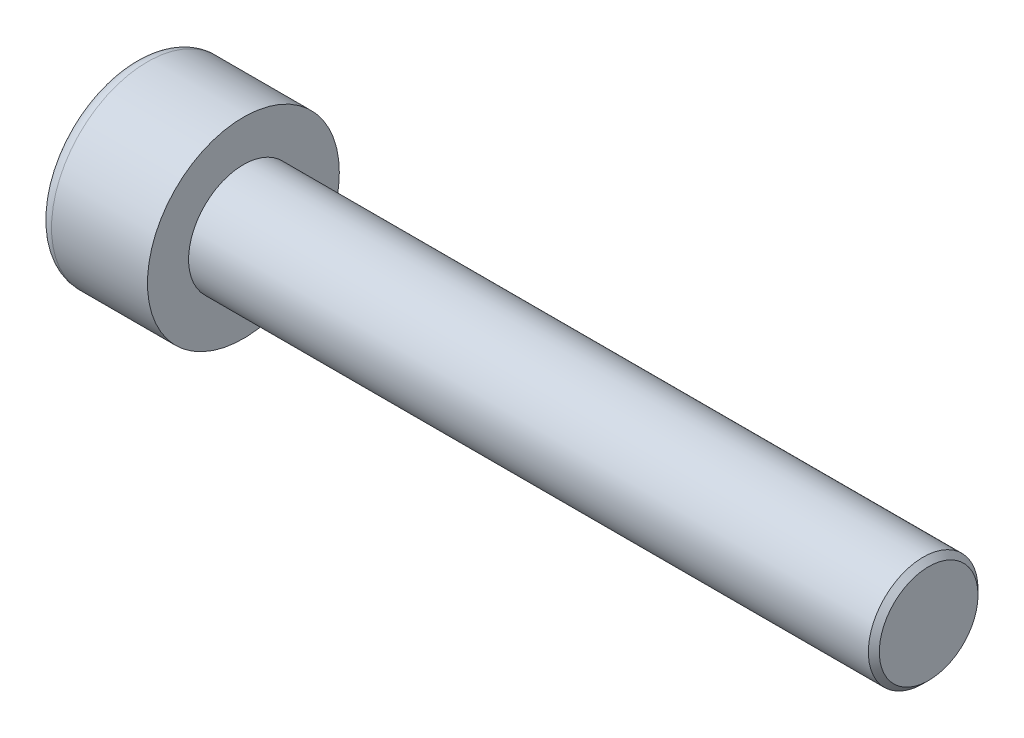
ISO-10303-21;
HEADER;
FILE_DESCRIPTION(('STEP AP214'),'2;1');
FILE_NAME('part.step','',(''),(''),'','','');
FILE_SCHEMA(('AUTOMOTIVE_DESIGN { 1 0 10303 214 1 1 1 1 }'));
ENDSEC;
DATA;
#1=APPLICATION_CONTEXT('core data for automotive mechanical design processes');
#2=APPLICATION_PROTOCOL_DEFINITION('international standard','automotive_design',2000,#1);
#3=PRODUCT_CONTEXT('',#1,'mechanical');
#4=PRODUCT('Part','Part','',(#3));
#5=PRODUCT_RELATED_PRODUCT_CATEGORY('part','',(#4));
#6=PRODUCT_DEFINITION_FORMATION('','',#4);
#7=PRODUCT_DEFINITION_CONTEXT('part definition',#1,'design');
#8=PRODUCT_DEFINITION('design','',#6,#7);
#9=PRODUCT_DEFINITION_SHAPE('','',#8);
#10=(LENGTH_UNIT() NAMED_UNIT(*) SI_UNIT(.MILLI.,.METRE.));
#11=(NAMED_UNIT(*) PLANE_ANGLE_UNIT() SI_UNIT($,.RADIAN.));
#12=(NAMED_UNIT(*) SI_UNIT($,.STERADIAN.) SOLID_ANGLE_UNIT());
#13=UNCERTAINTY_MEASURE_WITH_UNIT(LENGTH_MEASURE(1.E-05),#10,'distance_accuracy_value','');
#14=(GEOMETRIC_REPRESENTATION_CONTEXT(3) GLOBAL_UNCERTAINTY_ASSIGNED_CONTEXT((#13)) GLOBAL_UNIT_ASSIGNED_CONTEXT((#10,
#11,#12)) REPRESENTATION_CONTEXT('',''));
#15=CARTESIAN_POINT('',(0.,0.,0.));
#16=DIRECTION('',(0.,0.,1.));
#17=DIRECTION('',(1.,0.,0.));
#18=AXIS2_PLACEMENT_3D('',#15,#16,#17);
#19=CARTESIAN_POINT('',(2.,1.5,-2.59807621135331));
#20=DIRECTION('',(1.,0.,0.));
#21=DIRECTION('',(0.,0.,-1.));
#22=AXIS2_PLACEMENT_3D('',#19,#20,#21);
#23=PLANE('',#22);
#24=CARTESIAN_POINT('',(2.,0.,0.));
#25=DIRECTION('',(1.,0.,0.));
#26=DIRECTION('',(0.,0.,-1.));
#27=AXIS2_PLACEMENT_3D('',#24,#25,#26);
#28=CIRCLE('',#27,1.5);
#29=CARTESIAN_POINT('',(2.,-0.75,-1.29903810567666));
#30=VERTEX_POINT('',#29);
#31=CARTESIAN_POINT('',(2.,-1.5,0.));
#32=VERTEX_POINT('',#31);
#33=EDGE_CURVE('E161',#30,#32,#28,.F.);
#34=ORIENTED_EDGE('',*,*,#33,.F.);
#35=DIRECTION('',(0.,0.866025403784439,-0.5));
#36=VECTOR('',#35,1.);
#37=CARTESIAN_POINT('',(2.,-1.5,-0.866025403784437));
#38=LINE('',#37,#36);
#39=CARTESIAN_POINT('',(2.,-1.5,-0.866025403784437));
#40=VERTEX_POINT('',#39);
#41=EDGE_CURVE('E169',#40,#30,#38,.T.);
#42=ORIENTED_EDGE('',*,*,#41,.F.);
#43=DIRECTION('',(0.,0.,-1.));
#44=VECTOR('',#43,1.);
#45=CARTESIAN_POINT('',(2.,-1.5,0.86602540378444));
#46=LINE('',#45,#44);
#47=EDGE_CURVE('E186',#32,#40,#46,.T.);
#48=ORIENTED_EDGE('',*,*,#47,.F.);
#49=EDGE_LOOP('',(#34,#42,#48));
#50=FACE_BOUND('',#49,.T.);
#51=ADVANCED_FACE('F38',(#50),#23,.F.);
#52=CARTESIAN_POINT('',(2.,-0.75,1.29903810567666));
#53=VERTEX_POINT('',#52);
#54=EDGE_CURVE('E291',#32,#53,#28,.F.);
#55=ORIENTED_EDGE('',*,*,#54,.F.);
#56=CARTESIAN_POINT('',(2.,-1.5,0.86602540378444));
#57=VERTEX_POINT('',#56);
#58=EDGE_CURVE('E187',#57,#32,#46,.T.);
#59=ORIENTED_EDGE('',*,*,#58,.F.);
#60=DIRECTION('',(0.,-0.866025403784438,-0.5));
#61=VECTOR('',#60,1.);
#62=CARTESIAN_POINT('',(2.,0.,1.73205080756888));
#63=LINE('',#62,#61);
#64=EDGE_CURVE('E182',#53,#57,#63,.T.);
#65=ORIENTED_EDGE('',*,*,#64,.F.);
#66=EDGE_LOOP('',(#55,#59,#65));
#67=FACE_BOUND('',#66,.T.);
#68=ADVANCED_FACE('F127',(#67),#23,.F.);
#69=CARTESIAN_POINT('',(2.,0.75,1.29903810567666));
#70=VERTEX_POINT('',#69);
#71=EDGE_CURVE('E287',#53,#70,#28,.F.);
#72=ORIENTED_EDGE('',*,*,#71,.F.);
#73=CARTESIAN_POINT('',(2.,0.,1.73205080756888));
#74=VERTEX_POINT('',#73);
#75=EDGE_CURVE('E183',#74,#53,#63,.T.);
#76=ORIENTED_EDGE('',*,*,#75,.F.);
#77=DIRECTION('',(0.,-0.866025403784438,0.5));
#78=VECTOR('',#77,1.);
#79=CARTESIAN_POINT('',(2.,1.5,0.86602540378444));
#80=LINE('',#79,#78);
#81=EDGE_CURVE('E178',#70,#74,#80,.T.);
#82=ORIENTED_EDGE('',*,*,#81,.F.);
#83=EDGE_LOOP('',(#72,#76,#82));
#84=FACE_BOUND('',#83,.T.);
#85=ADVANCED_FACE('F133',(#84),#23,.F.);
#86=CARTESIAN_POINT('',(2.,1.5,0.));
#87=VERTEX_POINT('',#86);
#88=EDGE_CURVE('E158',#70,#87,#28,.F.);
#89=ORIENTED_EDGE('',*,*,#88,.F.);
#90=CARTESIAN_POINT('',(2.,1.5,0.86602540378444));
#91=VERTEX_POINT('',#90);
#92=EDGE_CURVE('E179',#91,#70,#80,.T.);
#93=ORIENTED_EDGE('',*,*,#92,.F.);
#94=DIRECTION('',(0.,0.,1.));
#95=VECTOR('',#94,1.);
#96=CARTESIAN_POINT('',(2.,1.5,-0.866025403784437));
#97=LINE('',#96,#95);
#98=EDGE_CURVE('E173',#87,#91,#97,.T.);
#99=ORIENTED_EDGE('',*,*,#98,.F.);
#100=EDGE_LOOP('',(#89,#93,#99));
#101=FACE_BOUND('',#100,.T.);
#102=ADVANCED_FACE('F147',(#101),#23,.F.);
#103=CARTESIAN_POINT('',(2.,0.,0.));
#104=DIRECTION('',(1.,0.,0.));
#105=DIRECTION('',(0.,0.,-1.));
#106=AXIS2_PLACEMENT_3D('',#103,#104,#105);
#107=CIRCLE('',#106,1.5);
#108=CARTESIAN_POINT('',(2.,0.749999999999999,-1.29903810567666));
#109=VERTEX_POINT('',#108);
#110=EDGE_CURVE('E53',#109,#87,#107,.T.);
#111=ORIENTED_EDGE('',*,*,#110,.T.);
#112=CARTESIAN_POINT('',(2.,1.5,-0.866025403784437));
#113=VERTEX_POINT('',#112);
#114=EDGE_CURVE('E166',#113,#87,#97,.T.);
#115=ORIENTED_EDGE('',*,*,#114,.F.);
#116=DIRECTION('',(0.,0.866025403784438,0.5));
#117=VECTOR('',#116,1.);
#118=CARTESIAN_POINT('',(2.,0.,-1.73205080756888));
#119=LINE('',#118,#117);
#120=EDGE_CURVE('E163',#109,#113,#119,.T.);
#121=ORIENTED_EDGE('',*,*,#120,.F.);
#122=EDGE_LOOP('',(#111,#115,#121));
#123=FACE_BOUND('',#122,.T.);
#124=ADVANCED_FACE('F138',(#123),#23,.F.);
#125=EDGE_CURVE('E151',#109,#30,#28,.F.);
#126=ORIENTED_EDGE('',*,*,#125,.F.);
#127=CARTESIAN_POINT('',(2.,0.,-1.73205080756888));
#128=VERTEX_POINT('',#127);
#129=EDGE_CURVE('E154',#128,#109,#119,.T.);
#130=ORIENTED_EDGE('',*,*,#129,.F.);
#131=EDGE_CURVE('E156',#30,#128,#38,.T.);
#132=ORIENTED_EDGE('',*,*,#131,.F.);
#133=EDGE_LOOP('',(#126,#130,#132));
#134=FACE_BOUND('',#133,.T.);
#135=ADVANCED_FACE('F129',(#134),#23,.F.);
#136=CARTESIAN_POINT('',(0.,0.,0.));
#137=DIRECTION('',(1.,0.,0.));
#138=DIRECTION('',(0.,0.,-1.));
#139=AXIS2_PLACEMENT_3D('',#136,#137,#138);
#140=PLANE('',#139);
#141=CARTESIAN_POINT('',(0.,0.,0.));
#142=DIRECTION('',(1.,0.,0.));
#143=DIRECTION('',(0.,0.,-1.));
#144=AXIS2_PLACEMENT_3D('',#141,#142,#143);
#145=CIRCLE('',#144,3.);
#146=CARTESIAN_POINT('',(0.,0.,-3.));
#147=VERTEX_POINT('',#146);
#148=EDGE_CURVE('E226',#147,#147,#145,.F.);
#149=ORIENTED_EDGE('',*,*,#148,.T.);
#150=EDGE_LOOP('',(#149));
#151=FACE_BOUND('',#150,.T.);
#152=DIRECTION('',(0.,0.866025403784439,-0.5));
#153=VECTOR('',#152,1.);
#154=CARTESIAN_POINT('',(0.,-1.5,-0.866025403784437));
#155=LINE('',#154,#153);
#156=CARTESIAN_POINT('',(0.,-1.5,-0.866025403784437));
#157=VERTEX_POINT('',#156);
#158=CARTESIAN_POINT('',(0.,0.,-1.73205080756888));
#159=VERTEX_POINT('',#158);
#160=EDGE_CURVE('E61',#157,#159,#155,.T.);
#161=ORIENTED_EDGE('',*,*,#160,.T.);
#162=DIRECTION('',(0.,0.866025403784438,0.5));
#163=VECTOR('',#162,1.);
#164=CARTESIAN_POINT('',(0.,0.,-1.73205080756888));
#165=LINE('',#164,#163);
#166=CARTESIAN_POINT('',(0.,1.5,-0.866025403784437));
#167=VERTEX_POINT('',#166);
#168=EDGE_CURVE('E192',#159,#167,#165,.T.);
#169=ORIENTED_EDGE('',*,*,#168,.T.);
#170=DIRECTION('',(0.,0.,1.));
#171=VECTOR('',#170,1.);
#172=CARTESIAN_POINT('',(0.,1.5,-0.866025403784437));
#173=LINE('',#172,#171);
#174=CARTESIAN_POINT('',(0.,1.5,0.86602540378444));
#175=VERTEX_POINT('',#174);
#176=EDGE_CURVE('E195',#167,#175,#173,.T.);
#177=ORIENTED_EDGE('',*,*,#176,.T.);
#178=DIRECTION('',(0.,-0.866025403784438,0.5));
#179=VECTOR('',#178,1.);
#180=CARTESIAN_POINT('',(0.,1.5,0.86602540378444));
#181=LINE('',#180,#179);
#182=CARTESIAN_POINT('',(0.,0.,1.73205080756888));
#183=VERTEX_POINT('',#182);
#184=EDGE_CURVE('E198',#175,#183,#181,.T.);
#185=ORIENTED_EDGE('',*,*,#184,.T.);
#186=DIRECTION('',(0.,-0.866025403784438,-0.5));
#187=VECTOR('',#186,1.);
#188=CARTESIAN_POINT('',(0.,0.,1.73205080756888));
#189=LINE('',#188,#187);
#190=CARTESIAN_POINT('',(0.,-1.5,0.86602540378444));
#191=VERTEX_POINT('',#190);
#192=EDGE_CURVE('E201',#183,#191,#189,.T.);
#193=ORIENTED_EDGE('',*,*,#192,.T.);
#194=DIRECTION('',(0.,0.,-1.));
#195=VECTOR('',#194,1.);
#196=CARTESIAN_POINT('',(0.,-1.5,0.86602540378444));
#197=LINE('',#196,#195);
#198=EDGE_CURVE('E204',#191,#157,#197,.T.);
#199=ORIENTED_EDGE('',*,*,#198,.T.);
#200=EDGE_LOOP('',(#161,#169,#177,#185,#193,#199));
#201=FACE_BOUND('',#200,.T.);
#202=ADVANCED_FACE('F137',(#151,#201),#140,.F.);
#203=CARTESIAN_POINT('',(4.,0.,0.));
#204=DIRECTION('',(1.,0.,0.));
#205=DIRECTION('',(0.,0.,-1.));
#206=AXIS2_PLACEMENT_3D('',#203,#204,#205);
#207=PLANE('',#206);
#208=CARTESIAN_POINT('',(4.,0.,0.));
#209=DIRECTION('',(1.,0.,0.));
#210=DIRECTION('',(0.,0.,-1.));
#211=AXIS2_PLACEMENT_3D('',#208,#209,#210);
#212=CIRCLE('',#211,3.5);
#213=CARTESIAN_POINT('',(4.,0.,-3.5));
#214=VERTEX_POINT('',#213);
#215=EDGE_CURVE('E159',#214,#214,#212,.T.);
#216=ORIENTED_EDGE('',*,*,#215,.T.);
#217=EDGE_LOOP('',(#216));
#218=FACE_BOUND('',#217,.T.);
#219=CARTESIAN_POINT('',(4.,0.,0.));
#220=DIRECTION('',(1.,0.,0.));
#221=DIRECTION('',(0.,0.,-1.));
#222=AXIS2_PLACEMENT_3D('',#219,#220,#221);
#223=CIRCLE('',#222,2.);
#224=CARTESIAN_POINT('',(4.,0.,-2.));
#225=VERTEX_POINT('',#224);
#226=EDGE_CURVE('E217',#225,#225,#223,.T.);
#227=ORIENTED_EDGE('',*,*,#226,.F.);
#228=EDGE_LOOP('',(#227));
#229=FACE_BOUND('',#228,.T.);
#230=ADVANCED_FACE('F144',(#218,#229),#207,.T.);
#231=CARTESIAN_POINT('',(4.,0.,0.));
#232=DIRECTION('',(-1.,0.,0.));
#233=DIRECTION('',(0.,0.,1.));
#234=AXIS2_PLACEMENT_3D('',#231,#232,#233);
#235=CYLINDRICAL_SURFACE('',#234,3.5);
#236=CARTESIAN_POINT('',(0.5,0.,0.));
#237=DIRECTION('',(1.,0.,0.));
#238=DIRECTION('',(0.,0.,-1.));
#239=AXIS2_PLACEMENT_3D('',#236,#237,#238);
#240=CIRCLE('',#239,3.5);
#241=CARTESIAN_POINT('',(0.5,0.,-3.5));
#242=VERTEX_POINT('',#241);
#243=EDGE_CURVE('E223',#242,#242,#240,.T.);
#244=ORIENTED_EDGE('',*,*,#243,.T.);
#245=EDGE_LOOP('',(#244));
#246=FACE_BOUND('',#245,.T.);
#247=ORIENTED_EDGE('',*,*,#215,.F.);
#248=EDGE_LOOP('',(#247));
#249=FACE_BOUND('',#248,.T.);
#250=ADVANCED_FACE('F242',(#246,#249),#235,.T.);
#251=CARTESIAN_POINT('',(29.,0.,0.));
#252=DIRECTION('',(-1.,0.,0.));
#253=DIRECTION('',(0.,0.,1.));
#254=AXIS2_PLACEMENT_3D('',#251,#252,#253);
#255=CYLINDRICAL_SURFACE('',#254,2.);
#256=CARTESIAN_POINT('',(28.8,0.,0.));
#257=DIRECTION('',(1.,0.,0.));
#258=DIRECTION('',(0.,0.,-1.));
#259=AXIS2_PLACEMENT_3D('',#256,#257,#258);
#260=CIRCLE('',#259,2.);
#261=CARTESIAN_POINT('',(28.8,0.,-2.));
#262=VERTEX_POINT('',#261);
#263=EDGE_CURVE('E11',#262,#262,#260,.F.);
#264=ORIENTED_EDGE('',*,*,#263,.T.);
#265=EDGE_LOOP('',(#264));
#266=FACE_BOUND('',#265,.T.);
#267=ORIENTED_EDGE('',*,*,#226,.T.);
#268=EDGE_LOOP('',(#267));
#269=FACE_BOUND('',#268,.T.);
#270=ADVANCED_FACE('F239',(#266,#269),#255,.T.);
#271=CARTESIAN_POINT('',(29.,0.,0.));
#272=DIRECTION('',(1.,0.,0.));
#273=DIRECTION('',(0.,0.,-1.));
#274=AXIS2_PLACEMENT_3D('',#271,#272,#273);
#275=PLANE('',#274);
#276=CARTESIAN_POINT('',(29.,0.,0.));
#277=DIRECTION('',(1.,0.,0.));
#278=DIRECTION('',(0.,0.,-1.));
#279=AXIS2_PLACEMENT_3D('',#276,#277,#278);
#280=CIRCLE('',#279,1.79999999999999);
#281=CARTESIAN_POINT('',(29.,0.,-1.79999999999999));
#282=VERTEX_POINT('',#281);
#283=EDGE_CURVE('E46',#282,#282,#280,.T.);
#284=ORIENTED_EDGE('',*,*,#283,.T.);
#285=EDGE_LOOP('',(#284));
#286=FACE_BOUND('',#285,.T.);
#287=ADVANCED_FACE('F231',(#286),#275,.T.);
#288=CARTESIAN_POINT('',(2.,-1.5,-0.866025403784437));
#289=DIRECTION('',(0.,0.5,0.866025403784439));
#290=DIRECTION('',(0.,-0.866025403784439,0.5));
#291=AXIS2_PLACEMENT_3D('',#288,#289,#290);
#292=PLANE('',#291);
#293=ORIENTED_EDGE('',*,*,#160,.F.);
#294=DIRECTION('',(-1.,0.,0.));
#295=VECTOR('',#294,1.);
#296=CARTESIAN_POINT('',(2.,-1.5,-0.866025403784437));
#297=LINE('',#296,#295);
#298=EDGE_CURVE('E190',#40,#157,#297,.T.);
#299=ORIENTED_EDGE('',*,*,#298,.F.);
#300=ORIENTED_EDGE('',*,*,#41,.T.);
#301=ORIENTED_EDGE('',*,*,#131,.T.);
#302=DIRECTION('',(-1.,0.,0.));
#303=VECTOR('',#302,1.);
#304=CARTESIAN_POINT('',(2.,0.,-1.73205080756888));
#305=LINE('',#304,#303);
#306=EDGE_CURVE('E172',#128,#159,#305,.T.);
#307=ORIENTED_EDGE('',*,*,#306,.T.);
#308=EDGE_LOOP('',(#293,#299,#300,#301,#307));
#309=FACE_BOUND('',#308,.T.);
#310=ADVANCED_FACE('F257',(#309),#292,.T.);
#311=CARTESIAN_POINT('',(2.,0.,-1.73205080756888));
#312=DIRECTION('',(0.,-0.5,0.866025403784439));
#313=DIRECTION('',(0.,-0.866025403784438,-0.5));
#314=AXIS2_PLACEMENT_3D('',#311,#312,#313);
#315=PLANE('',#314);
#316=ORIENTED_EDGE('',*,*,#168,.F.);
#317=ORIENTED_EDGE('',*,*,#306,.F.);
#318=ORIENTED_EDGE('',*,*,#129,.T.);
#319=ORIENTED_EDGE('',*,*,#120,.T.);
#320=DIRECTION('',(-1.,0.,0.));
#321=VECTOR('',#320,1.);
#322=CARTESIAN_POINT('',(2.,1.5,-0.866025403784437));
#323=LINE('',#322,#321);
#324=EDGE_CURVE('E214',#113,#167,#323,.T.);
#325=ORIENTED_EDGE('',*,*,#324,.T.);
#326=EDGE_LOOP('',(#316,#317,#318,#319,#325));
#327=FACE_BOUND('',#326,.T.);
#328=ADVANCED_FACE('F171',(#327),#315,.T.);
#329=CARTESIAN_POINT('',(2.,1.5,-0.866025403784437));
#330=DIRECTION('',(0.,-1.,0.));
#331=DIRECTION('',(0.,0.,-1.));
#332=AXIS2_PLACEMENT_3D('',#329,#330,#331);
#333=PLANE('',#332);
#334=ORIENTED_EDGE('',*,*,#176,.F.);
#335=ORIENTED_EDGE('',*,*,#324,.F.);
#336=ORIENTED_EDGE('',*,*,#114,.T.);
#337=ORIENTED_EDGE('',*,*,#98,.T.);
#338=DIRECTION('',(-1.,0.,0.));
#339=VECTOR('',#338,1.);
#340=CARTESIAN_POINT('',(2.,1.5,0.86602540378444));
#341=LINE('',#340,#339);
#342=EDGE_CURVE('E212',#91,#175,#341,.T.);
#343=ORIENTED_EDGE('',*,*,#342,.T.);
#344=EDGE_LOOP('',(#334,#335,#336,#337,#343));
#345=FACE_BOUND('',#344,.T.);
#346=ADVANCED_FACE('F262',(#345),#333,.T.);
#347=CARTESIAN_POINT('',(2.,1.5,0.86602540378444));
#348=DIRECTION('',(0.,-0.5,-0.866025403784439));
#349=DIRECTION('',(0.,0.866025403784439,-0.5));
#350=AXIS2_PLACEMENT_3D('',#347,#348,#349);
#351=PLANE('',#350);
#352=ORIENTED_EDGE('',*,*,#184,.F.);
#353=ORIENTED_EDGE('',*,*,#342,.F.);
#354=ORIENTED_EDGE('',*,*,#92,.T.);
#355=ORIENTED_EDGE('',*,*,#81,.T.);
#356=DIRECTION('',(-1.,0.,0.));
#357=VECTOR('',#356,1.);
#358=CARTESIAN_POINT('',(2.,0.,1.73205080756888));
#359=LINE('',#358,#357);
#360=EDGE_CURVE('E210',#74,#183,#359,.T.);
#361=ORIENTED_EDGE('',*,*,#360,.T.);
#362=EDGE_LOOP('',(#352,#353,#354,#355,#361));
#363=FACE_BOUND('',#362,.T.);
#364=ADVANCED_FACE('F265',(#363),#351,.T.);
#365=CARTESIAN_POINT('',(2.,0.,1.73205080756888));
#366=DIRECTION('',(0.,0.5,-0.866025403784439));
#367=DIRECTION('',(0.,0.866025403784438,0.5));
#368=AXIS2_PLACEMENT_3D('',#365,#366,#367);
#369=PLANE('',#368);
#370=ORIENTED_EDGE('',*,*,#192,.F.);
#371=ORIENTED_EDGE('',*,*,#360,.F.);
#372=ORIENTED_EDGE('',*,*,#75,.T.);
#373=ORIENTED_EDGE('',*,*,#64,.T.);
#374=DIRECTION('',(-1.,0.,0.));
#375=VECTOR('',#374,1.);
#376=CARTESIAN_POINT('',(2.,-1.5,0.86602540378444));
#377=LINE('',#376,#375);
#378=EDGE_CURVE('E208',#57,#191,#377,.T.);
#379=ORIENTED_EDGE('',*,*,#378,.T.);
#380=EDGE_LOOP('',(#370,#371,#372,#373,#379));
#381=FACE_BOUND('',#380,.T.);
#382=ADVANCED_FACE('F122',(#381),#369,.T.);
#383=CARTESIAN_POINT('',(2.,-1.5,0.86602540378444));
#384=DIRECTION('',(0.,1.,0.));
#385=DIRECTION('',(0.,0.,1.));
#386=AXIS2_PLACEMENT_3D('',#383,#384,#385);
#387=PLANE('',#386);
#388=ORIENTED_EDGE('',*,*,#198,.F.);
#389=ORIENTED_EDGE('',*,*,#378,.F.);
#390=ORIENTED_EDGE('',*,*,#58,.T.);
#391=ORIENTED_EDGE('',*,*,#47,.T.);
#392=ORIENTED_EDGE('',*,*,#298,.T.);
#393=EDGE_LOOP('',(#388,#389,#390,#391,#392));
#394=FACE_BOUND('',#393,.T.);
#395=ADVANCED_FACE('F115',(#394),#387,.T.);
#396=CARTESIAN_POINT('',(2.,0.,0.));
#397=DIRECTION('',(-1.,0.,0.));
#398=DIRECTION('',(0.,0.,1.));
#399=AXIS2_PLACEMENT_3D('',#396,#397,#398);
#400=CONICAL_SURFACE('',#399,1.5,1.04719755119659);
#401=CARTESIAN_POINT('',(2.86602540378445,0.,0.));
#402=VERTEX_POINT('',#401);
#403=VERTEX_LOOP('',#402);
#404=FACE_BOUND('',#403,.T.);
#405=ORIENTED_EDGE('',*,*,#110,.F.);
#406=ORIENTED_EDGE('',*,*,#125,.T.);
#407=ORIENTED_EDGE('',*,*,#33,.T.);
#408=ORIENTED_EDGE('',*,*,#54,.T.);
#409=ORIENTED_EDGE('',*,*,#71,.T.);
#410=ORIENTED_EDGE('',*,*,#88,.T.);
#411=EDGE_LOOP('',(#405,#406,#407,#408,#409,#410));
#412=FACE_BOUND('',#411,.T.);
#413=ADVANCED_FACE('F112',(#404,#412),#400,.F.);
#414=CARTESIAN_POINT('',(0.5,0.,0.));
#415=DIRECTION('',(1.,0.,0.));
#416=DIRECTION('',(0.,0.,-1.));
#417=AXIS2_PLACEMENT_3D('',#414,#415,#416);
#418=TOROIDAL_SURFACE('',#417,3.,0.5);
#419=ORIENTED_EDGE('',*,*,#148,.F.);
#420=EDGE_LOOP('',(#419));
#421=FACE_BOUND('',#420,.T.);
#422=ORIENTED_EDGE('',*,*,#243,.F.);
#423=EDGE_LOOP('',(#422));
#424=FACE_BOUND('',#423,.T.);
#425=ADVANCED_FACE('F114',(#421,#424),#418,.T.);
#426=CARTESIAN_POINT('',(29.,0.,0.));
#427=DIRECTION('',(-1.,0.,0.));
#428=DIRECTION('',(0.,0.,1.));
#429=AXIS2_PLACEMENT_3D('',#426,#427,#428);
#430=CONICAL_SURFACE('',#429,1.79999999999999,0.785398163397461);
#431=ORIENTED_EDGE('',*,*,#263,.F.);
#432=EDGE_LOOP('',(#431));
#433=FACE_BOUND('',#432,.T.);
#434=ORIENTED_EDGE('',*,*,#283,.F.);
#435=EDGE_LOOP('',(#434));
#436=FACE_BOUND('',#435,.T.);
#437=ADVANCED_FACE('F40',(#433,#436),#430,.T.);
#438=CLOSED_SHELL('',(#51,#68,#85,#102,#124,#135,#202,#230,#250,#270,#287,#310,#328,#346,#364,
#382,#395,#413,#425,#437));
#439=MANIFOLD_SOLID_BREP('B2',#438);
#440=ADVANCED_BREP_SHAPE_REPRESENTATION('',(#18,#439),#14);
#441=SHAPE_DEFINITION_REPRESENTATION(#9,#440);
ENDSEC;
END-ISO-10303-21;
